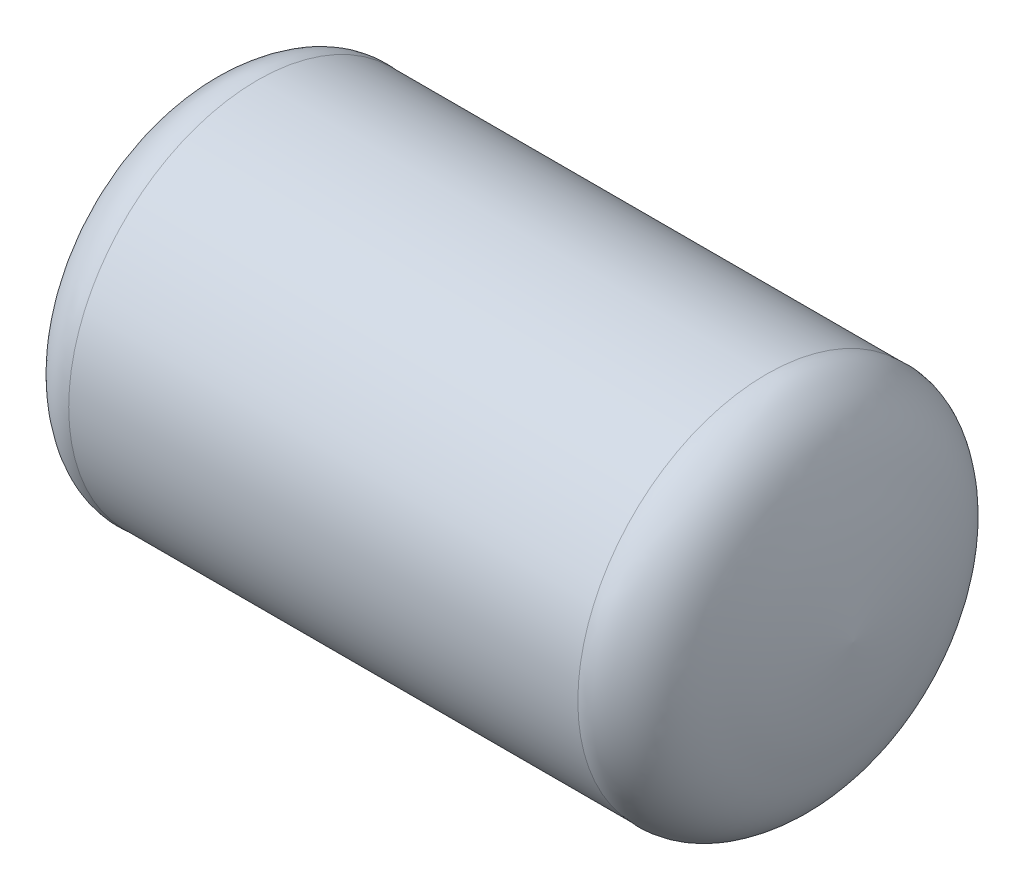
ISO-10303-21;
HEADER;
FILE_DESCRIPTION(('STEP AP214'),'2;1');
FILE_NAME('part.step','',(''),(''),'','','');
FILE_SCHEMA(('AUTOMOTIVE_DESIGN { 1 0 10303 214 1 1 1 1 }'));
ENDSEC;
DATA;
#1=APPLICATION_CONTEXT('core data for automotive mechanical design processes');
#2=APPLICATION_PROTOCOL_DEFINITION('international standard','automotive_design',2000,#1);
#3=PRODUCT_CONTEXT('',#1,'mechanical');
#4=PRODUCT('Part','Part','',(#3));
#5=PRODUCT_RELATED_PRODUCT_CATEGORY('part','',(#4));
#6=PRODUCT_DEFINITION_FORMATION('','',#4);
#7=PRODUCT_DEFINITION_CONTEXT('part definition',#1,'design');
#8=PRODUCT_DEFINITION('design','',#6,#7);
#9=PRODUCT_DEFINITION_SHAPE('','',#8);
#10=(LENGTH_UNIT() NAMED_UNIT(*) SI_UNIT(.MILLI.,.METRE.));
#11=(NAMED_UNIT(*) PLANE_ANGLE_UNIT() SI_UNIT($,.RADIAN.));
#12=(NAMED_UNIT(*) SI_UNIT($,.STERADIAN.) SOLID_ANGLE_UNIT());
#13=UNCERTAINTY_MEASURE_WITH_UNIT(LENGTH_MEASURE(1.E-05),#10,'distance_accuracy_value','');
#14=(GEOMETRIC_REPRESENTATION_CONTEXT(3) GLOBAL_UNCERTAINTY_ASSIGNED_CONTEXT((#13)) GLOBAL_UNIT_ASSIGNED_CONTEXT((#10,
#11,#12)) REPRESENTATION_CONTEXT('',''));
#15=CARTESIAN_POINT('',(0.,0.,0.));
#16=DIRECTION('',(0.,0.,1.));
#17=DIRECTION('',(1.,0.,0.));
#18=AXIS2_PLACEMENT_3D('',#15,#16,#17);
#19=CARTESIAN_POINT('',(129.087328059803,0.,0.));
#20=CARTESIAN_POINT('',(128.353786474958,9.78138149496184,0.));
#21=CARTESIAN_POINT('',(126.328681606354,27.1874004822242,0.));
#22=CARTESIAN_POINT('',(120.327737662313,49.6484530215984,0.));
#23=CARTESIAN_POINT('',(115.950444214237,64.6459954588004,0.));
#24=CARTESIAN_POINT('',(100.906558404916,72.1516182260832,0.));
#25=CARTESIAN_POINT('',(96.3096679568436,71.4229260268189,0.));
#26=B_SPLINE_CURVE_WITH_KNOTS('',3,(#19,#20,#21,#22,#23,#24,#25),.UNSPECIFIED.,.F.,.F.,(4,1,1,1,
4),(0.,0.382349677005068,0.474547953280148,0.872267783920731,1.),.UNSPECIFIED.);
#27=CARTESIAN_POINT('',(-129.087328059803,0.,0.));
#28=DIRECTION('',(-1.,0.,0.));
#29=AXIS1_PLACEMENT('',#27,#28);
#30=SURFACE_OF_REVOLUTION('',#26,#29);
#31=CARTESIAN_POINT('',(96.3096679568437,0.,0.));
#32=DIRECTION('',(-1.,0.,0.));
#33=DIRECTION('',(0.,0.,1.));
#34=AXIS2_PLACEMENT_3D('',#31,#32,#33);
#35=CIRCLE('',#34,71.4229260268189);
#36=CARTESIAN_POINT('',(96.3096679568437,0.,71.4229260268189));
#37=VERTEX_POINT('',#36);
#38=EDGE_CURVE('E44',#37,#37,#35,.T.);
#39=ORIENTED_EDGE('',*,*,#38,.F.);
#40=EDGE_LOOP('',(#39));
#41=FACE_BOUND('',#40,.T.);
#42=CARTESIAN_POINT('',(129.087328059803,0.,0.));
#43=VERTEX_POINT('',#42);
#44=VERTEX_LOOP('',#43);
#45=FACE_BOUND('',#44,.T.);
#46=ADVANCED_FACE('F36',(#41,#45),#30,.T.);
#47=CARTESIAN_POINT('',(-96.3096679568436,71.4229260268189,0.));
#48=CARTESIAN_POINT('',(-100.906558404916,72.1516182260832,0.));
#49=CARTESIAN_POINT('',(-115.950444214237,64.6459954588004,0.));
#50=CARTESIAN_POINT('',(-120.327737662313,49.6484530215983,0.));
#51=CARTESIAN_POINT('',(-126.328681606354,27.1874004822242,0.));
#52=CARTESIAN_POINT('',(-128.353786474958,9.78138149496184,0.));
#53=CARTESIAN_POINT('',(-129.087328059803,0.,0.));
#54=B_SPLINE_CURVE_WITH_KNOTS('',3,(#47,#48,#49,#50,#51,#52,#53),.UNSPECIFIED.,.F.,.F.,(4,1,1,1,
4),(0.,0.127732216079269,0.525452046719852,0.617650322994932,1.),.UNSPECIFIED.);
#55=CARTESIAN_POINT('',(-129.087328059803,0.,0.));
#56=DIRECTION('',(-1.,0.,0.));
#57=AXIS1_PLACEMENT('',#55,#56);
#58=SURFACE_OF_REVOLUTION('',#54,#57);
#59=CARTESIAN_POINT('',(-129.087328059803,0.,0.));
#60=VERTEX_POINT('',#59);
#61=VERTEX_LOOP('',#60);
#62=FACE_BOUND('',#61,.T.);
#63=CARTESIAN_POINT('',(-96.3096679568436,0.,0.));
#64=DIRECTION('',(-1.,0.,0.));
#65=DIRECTION('',(0.,0.,1.));
#66=AXIS2_PLACEMENT_3D('',#63,#64,#65);
#67=CIRCLE('',#66,71.4229260268189);
#68=CARTESIAN_POINT('',(-96.3096679568436,0.,71.4229260268189));
#69=VERTEX_POINT('',#68);
#70=EDGE_CURVE('E11',#69,#69,#67,.T.);
#71=ORIENTED_EDGE('',*,*,#70,.T.);
#72=EDGE_LOOP('',(#71));
#73=FACE_BOUND('',#72,.T.);
#74=ADVANCED_FACE('F87',(#62,#73),#58,.T.);
#75=CARTESIAN_POINT('',(-129.087328059803,0.,0.));
#76=DIRECTION('',(-1.,0.,0.));
#77=DIRECTION('',(0.,0.,1.));
#78=AXIS2_PLACEMENT_3D('',#75,#76,#77);
#79=CYLINDRICAL_SURFACE('',#78,71.4229260268189);
#80=ORIENTED_EDGE('',*,*,#70,.F.);
#81=EDGE_LOOP('',(#80));
#82=FACE_BOUND('',#81,.T.);
#83=ORIENTED_EDGE('',*,*,#38,.T.);
#84=EDGE_LOOP('',(#83));
#85=FACE_BOUND('',#84,.T.);
#86=ADVANCED_FACE('F90',(#82,#85),#79,.T.);
#87=CLOSED_SHELL('',(#46,#74,#86));
#88=CARTESIAN_POINT('',(126.078801352395,-1.95102180938767E-13,0.));
#89=CARTESIAN_POINT('',(125.825291509153,3.33983077298832,0.));
#90=CARTESIAN_POINT('',(125.508847194141,6.67067911120759,0.));
#91=CARTESIAN_POINT('',(124.774667491553,13.317918838594,0.));
#92=CARTESIAN_POINT('',(124.355801061866,16.6341487977578,0.));
#93=CARTESIAN_POINT('',(123.391264796605,23.2485104737414,0.));
#94=CARTESIAN_POINT('',(122.847403047178,26.5469002528825,0.));
#95=CARTESIAN_POINT('',(121.877744354474,31.4725241124351,0.));
#96=CARTESIAN_POINT('',(121.527589343913,33.1105543226516,0.));
#97=CARTESIAN_POINT('',(120.75261991232,36.3759588455201,0.));
#98=CARTESIAN_POINT('',(120.330818984548,37.9991514239466,0.));
#99=CARTESIAN_POINT('',(119.678852054631,40.4274323035721,0.));
#100=CARTESIAN_POINT('',(119.459251143792,41.2361674778664,0.));
#101=CARTESIAN_POINT('',(119.016554178461,42.8525766972246,0.));
#102=CARTESIAN_POINT('',(118.792543707451,43.6599731244881,0.));
#103=CARTESIAN_POINT('',(118.101578534734,46.0764140972439,0.));
#104=CARTESIAN_POINT('',(117.616105801462,47.6798365491909,0.));
#105=CARTESIAN_POINT('',(116.800579899698,50.0584607557123,0.));
#106=CARTESIAN_POINT('',(116.51408978389,50.8468882981608,0.));
#107=CARTESIAN_POINT('',(115.902061746615,52.4118884288526,0.));
#108=CARTESIAN_POINT('',(115.575686437894,53.1902450100822,0.));
#109=CARTESIAN_POINT('',(114.528463327216,55.4878434506994,0.));
#110=CARTESIAN_POINT('',(113.740916631127,56.9669412231359,0.));
#111=CARTESIAN_POINT('',(112.376611407121,59.0778523381705,0.));
#112=CARTESIAN_POINT('',(111.891378845949,59.7635531037258,0.));
#113=CARTESIAN_POINT('',(110.852675062343,61.0947779971865,0.));
#114=CARTESIAN_POINT('',(110.302938539517,61.7350134151658,0.));
#115=CARTESIAN_POINT('',(108.57759888472,63.5600349841419,0.));
#116=CARTESIAN_POINT('',(107.319260444614,64.6567080876908,0.));
#117=CARTESIAN_POINT('',(105.280496447172,66.1338181461384,0.));
#118=CARTESIAN_POINT('',(104.572544394502,66.6027497182221,0.));
#119=CARTESIAN_POINT('',(103.104629812159,67.4252107279558,0.));
#120=CARTESIAN_POINT('',(102.343993861933,67.780062017957,0.));
#121=CARTESIAN_POINT('',(101.142489184808,68.1843788542768,0.));
#122=CARTESIAN_POINT('',(100.73141681394,68.2973034388826,0.));
#123=CARTESIAN_POINT('',(99.9079449515384,68.4683704628319,0.));
#124=CARTESIAN_POINT('',(99.493063129789,68.5274496983513,0.));
#125=CARTESIAN_POINT('',(98.6567545826988,68.5905710705768,0.));
#126=CARTESIAN_POINT('',(98.2351163315806,68.5946044184707,0.));
#127=CARTESIAN_POINT('',(97.5983475273637,68.5590204169165,0.));
#128=CARTESIAN_POINT('',(97.386883628274,68.5403259392713,0.));
#129=CARTESIAN_POINT('',(96.9654644591823,68.4899270356952,0.));
#130=CARTESIAN_POINT('',(96.7557461247832,68.456179350778,0.));
#131=CARTESIAN_POINT('',(96.5459704644588,68.4229260268189,0.));
#132=B_SPLINE_CURVE_WITH_KNOTS('',3,(#88,#89,#90,#91,#92,#93,#94,#95,#96,#97,#98,#99,#100,#101,
#102,#103,#104,#105,#106,#107,#108,#109,#110,#111,#112,#113,#114,#115,#116,#117,#118,#119,#120,
#121,#122,#123,#124,#125,#126,#127,#128,#129,#130,#131),.UNSPECIFIED.,.F.,.F.,(4,2,2,2,2,2,2,2,
2,2,2,2,2,2,2,2,2,2,2,2,2,4),(0.,0.125,0.25,0.375,0.4375,0.5,0.531250000000001,
0.562500000000001,0.625000000000001,0.656250000000001,0.687500000000001,0.750000000000001,
0.781250000000001,0.812500000000001,0.875000000000001,0.906250000000001,0.937500000000001,
0.953125000000001,0.96875,0.984375,0.9921875,1.),.UNSPECIFIED.);
#133=CARTESIAN_POINT('',(-126.078801352395,1.95102180938767E-13,0.));
#134=DIRECTION('',(-1.,0.,0.));
#135=AXIS1_PLACEMENT('',#133,#134);
#136=SURFACE_OF_REVOLUTION('',#132,#135);
#137=CARTESIAN_POINT('',(96.5459704644587,-1.49401241100138E-13,0.));
#138=DIRECTION('',(-1.,0.,0.));
#139=DIRECTION('',(0.,-1.,0.));
#140=AXIS2_PLACEMENT_3D('',#137,#138,#139);
#141=CIRCLE('',#140,68.4229260268191);
#142=CARTESIAN_POINT('',(96.5459704644586,-68.4229260268193,0.));
#143=VERTEX_POINT('',#142);
#144=EDGE_CURVE('E68',#143,#143,#141,.T.);
#145=ORIENTED_EDGE('',*,*,#144,.T.);
#146=EDGE_LOOP('',(#145));
#147=FACE_BOUND('',#146,.T.);
#148=CARTESIAN_POINT('',(126.078801352395,-1.95102180938767E-13,0.));
#149=VERTEX_POINT('',#148);
#150=VERTEX_LOOP('',#149);
#151=FACE_BOUND('',#150,.T.);
#152=ADVANCED_FACE('F61',(#147,#151),#136,.F.);
#153=CARTESIAN_POINT('',(-96.5459704644589,68.4229260268189,0.));
#154=CARTESIAN_POINT('',(-96.7567249303507,68.4563345095727,0.));
#155=CARTESIAN_POINT('',(-96.9674786137911,68.4902109659968,0.));
#156=CARTESIAN_POINT('',(-97.389015117762,68.5405373746992,0.));
#157=CARTESIAN_POINT('',(-97.5997944044531,68.5591008690437,0.));
#158=CARTESIAN_POINT('',(-98.232166291341,68.5944403687771,0.));
#159=CARTESIAN_POINT('',(-98.6537929951939,68.5908194332111,0.));
#160=CARTESIAN_POINT('',(-99.4971408047696,68.5271170648146,0.));
#161=CARTESIAN_POINT('',(-99.9215133617576,68.4664100947421,0.));
#162=CARTESIAN_POINT('',(-100.757413414491,68.2910030087706,0.));
#163=CARTESIAN_POINT('',(-101.166133269368,68.1773864642695,0.));
#164=CARTESIAN_POINT('',(-101.96772340563,67.9056569081691,0.));
#165=CARTESIAN_POINT('',(-102.360596481692,67.7475517424173,0.));
#166=CARTESIAN_POINT('',(-103.132976868577,67.3938180457909,0.));
#167=CARTESIAN_POINT('',(-103.513838931908,67.1973429582472,0.));
#168=CARTESIAN_POINT('',(-104.624644096735,66.5704638376949,0.));
#169=CARTESIAN_POINT('',(-105.327052628226,66.1022073507998,0.));
#170=CARTESIAN_POINT('',(-106.689961654332,65.1103672063994,0.));
#171=CARTESIAN_POINT('',(-107.348671058446,64.5844189435071,0.));
#172=CARTESIAN_POINT('',(-108.300231491133,63.7473042423628,0.));
#173=CARTESIAN_POINT('',(-108.611337633867,63.4602382843755,0.));
#174=CARTESIAN_POINT('',(-109.221050533384,62.8696046252859,0.));
#175=CARTESIAN_POINT('',(-109.519923336402,62.5656790610282,0.));
#176=CARTESIAN_POINT('',(-110.969214004035,61.0186176020046,0.));
#177=CARTESIAN_POINT('',(-111.994578680948,59.6823714803537,0.));
#178=CARTESIAN_POINT('',(-113.35899878932,57.5503125995714,0.));
#179=CARTESIAN_POINT('',(-113.786052714339,56.81657903943,0.));
#180=CARTESIAN_POINT('',(-114.584652245021,55.3200150926451,0.));
#181=CARTESIAN_POINT('',(-114.953648693243,54.562568491406,0.));
#182=CARTESIAN_POINT('',(-115.987832153184,52.2682100144209,0.));
#183=CARTESIAN_POINT('',(-116.580776889826,50.7094499177927,0.));
#184=CARTESIAN_POINT('',(-117.654215242432,47.5579211482502,0.));
#185=CARTESIAN_POINT('',(-118.134498326819,45.9650888043013,0.));
#186=CARTESIAN_POINT('',(-118.819102049546,43.5650069775669,0.));
#187=CARTESIAN_POINT('',(-119.041232790608,42.7631438015914,0.));
#188=CARTESIAN_POINT('',(-119.480480869456,41.1579012468073,0.));
#189=CARTESIAN_POINT('',(-119.698526031922,40.3548024698833,0.));
#190=CARTESIAN_POINT('',(-120.345438769093,37.943321763797,0.));
#191=CARTESIAN_POINT('',(-120.763598961111,36.3317016024255,0.));
#192=CARTESIAN_POINT('',(-121.532443652219,33.0880546155554,0.));
#193=CARTESIAN_POINT('',(-121.881276064712,31.455467663773,0.));
#194=CARTESIAN_POINT('',(-122.526812372474,28.1745285402265,0.));
#195=CARTESIAN_POINT('',(-122.823815225399,26.5270754066892,0.));
#196=CARTESIAN_POINT('',(-123.377766808168,23.2298854296605,0.));
#197=CARTESIAN_POINT('',(-123.634859772802,21.5787632264305,0.));
#198=CARTESIAN_POINT('',(-124.357762795551,16.6192477821198,0.));
#199=CARTESIAN_POINT('',(-124.776225843918,13.3048364802634,0.));
#200=CARTESIAN_POINT('',(-125.509597953722,6.66285160526279,0.));
#201=CARTESIAN_POINT('',(-125.825626286278,3.33542029752592,0.));
#202=CARTESIAN_POINT('',(-126.078801352395,1.86404571332275E-13,0.));
#203=B_SPLINE_CURVE_WITH_KNOTS('',3,(#153,#154,#155,#156,#157,#158,#159,#160,#161,#162,#163,
#164,#165,#166,#167,#168,#169,#170,#171,#172,#173,#174,#175,#176,#177,#178,#179,#180,#181,#182,
#183,#184,#185,#186,#187,#188,#189,#190,#191,#192,#193,#194,#195,#196,#197,#198,#199,#200,#201,
#202),.UNSPECIFIED.,.F.,.F.,(4,2,2,2,2,2,2,2,2,2,2,2,2,2,2,2,2,2,2,2,2,2,2,2,4),(0.,
0.0078125000000004,0.0156250000000008,0.0312500000000011,0.0468750000000014,0.0625000000000017,
0.078125000000002,0.0937500000000024,0.125000000000003,0.156250000000004,0.171875000000004,
0.187500000000004,0.250000000000005,0.281250000000005,0.312500000000004,0.375000000000004,
0.437500000000004,0.468750000000004,0.500000000000004,0.562500000000003,0.625000000000003,
0.687500000000002,0.750000000000002,0.875000000000001,1.),.UNSPECIFIED.);
#204=CARTESIAN_POINT('',(-126.078801352395,1.95102180938767E-13,0.));
#205=DIRECTION('',(-1.,0.,0.));
#206=AXIS1_PLACEMENT('',#204,#205);
#207=SURFACE_OF_REVOLUTION('',#203,#206);
#208=CARTESIAN_POINT('',(-126.078801352395,1.95102180938767E-13,0.));
#209=VERTEX_POINT('',#208);
#210=VERTEX_LOOP('',#209);
#211=FACE_BOUND('',#210,.T.);
#212=CARTESIAN_POINT('',(-96.545970464459,1.49401241100139E-13,0.));
#213=DIRECTION('',(-1.,0.,0.));
#214=DIRECTION('',(0.,-1.,0.));
#215=AXIS2_PLACEMENT_3D('',#212,#213,#214);
#216=CIRCLE('',#215,68.4229260268188);
#217=CARTESIAN_POINT('',(-96.5459704644591,-68.4229260268186,0.));
#218=VERTEX_POINT('',#217);
#219=EDGE_CURVE('E66',#218,#218,#216,.T.);
#220=ORIENTED_EDGE('',*,*,#219,.F.);
#221=EDGE_LOOP('',(#220));
#222=FACE_BOUND('',#221,.T.);
#223=ADVANCED_FACE('F57',(#211,#222),#207,.F.);
#224=CARTESIAN_POINT('',(-126.078801352395,1.95102180938767E-13,0.));
#225=DIRECTION('',(-1.,0.,0.));
#226=DIRECTION('',(0.,-1.,0.));
#227=AXIS2_PLACEMENT_3D('',#224,#225,#226);
#228=CYLINDRICAL_SURFACE('',#227,68.4229260268189);
#229=ORIENTED_EDGE('',*,*,#219,.T.);
#230=EDGE_LOOP('',(#229));
#231=FACE_BOUND('',#230,.T.);
#232=ORIENTED_EDGE('',*,*,#144,.F.);
#233=EDGE_LOOP('',(#232));
#234=FACE_BOUND('',#233,.T.);
#235=ADVANCED_FACE('F60',(#231,#234),#228,.F.);
#236=CLOSED_SHELL('',(#152,#223,#235));
#237=ORIENTED_CLOSED_SHELL('',*,#236,.T.);
#238=BREP_WITH_VOIDS('B2',#87,(#237));
#239=ADVANCED_BREP_SHAPE_REPRESENTATION('',(#18,#238),#14);
#240=SHAPE_DEFINITION_REPRESENTATION(#9,#239);
ENDSEC;
END-ISO-10303-21;
